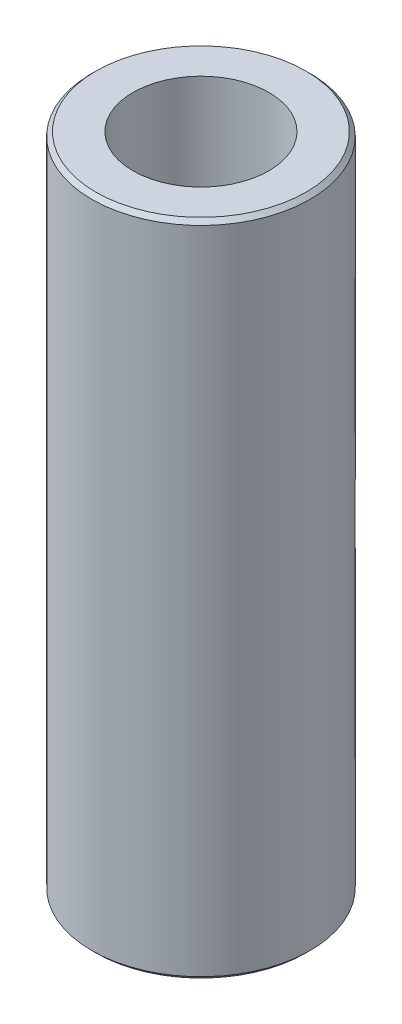
ISO-10303-21;
HEADER;
FILE_DESCRIPTION(('STEP AP214'),'2;1');
FILE_NAME('part.step','',(''),(''),'','','');
FILE_SCHEMA(('AUTOMOTIVE_DESIGN { 1 0 10303 214 1 1 1 1 }'));
ENDSEC;
DATA;
#1=APPLICATION_CONTEXT('core data for automotive mechanical design processes');
#2=APPLICATION_PROTOCOL_DEFINITION('international standard','automotive_design',2000,#1);
#3=PRODUCT_CONTEXT('',#1,'mechanical');
#4=PRODUCT('Part','Part','',(#3));
#5=PRODUCT_RELATED_PRODUCT_CATEGORY('part','',(#4));
#6=PRODUCT_DEFINITION_FORMATION('','',#4);
#7=PRODUCT_DEFINITION_CONTEXT('part definition',#1,'design');
#8=PRODUCT_DEFINITION('design','',#6,#7);
#9=PRODUCT_DEFINITION_SHAPE('','',#8);
#10=(LENGTH_UNIT() NAMED_UNIT(*) SI_UNIT(.MILLI.,.METRE.));
#11=(NAMED_UNIT(*) PLANE_ANGLE_UNIT() SI_UNIT($,.RADIAN.));
#12=(NAMED_UNIT(*) SI_UNIT($,.STERADIAN.) SOLID_ANGLE_UNIT());
#13=UNCERTAINTY_MEASURE_WITH_UNIT(LENGTH_MEASURE(1.E-05),#10,'distance_accuracy_value','');
#14=(GEOMETRIC_REPRESENTATION_CONTEXT(3) GLOBAL_UNCERTAINTY_ASSIGNED_CONTEXT((#13)) GLOBAL_UNIT_ASSIGNED_CONTEXT((#10,
#11,#12)) REPRESENTATION_CONTEXT('',''));
#15=CARTESIAN_POINT('',(0.,0.,0.));
#16=DIRECTION('',(0.,0.,1.));
#17=DIRECTION('',(1.,0.,0.));
#18=AXIS2_PLACEMENT_3D('',#15,#16,#17);
#19=CARTESIAN_POINT('',(0.,16.,0.));
#20=DIRECTION('',(0.,1.,0.));
#21=DIRECTION('',(0.,0.,1.));
#22=AXIS2_PLACEMENT_3D('',#19,#20,#21);
#23=PLANE('',#22);
#24=CARTESIAN_POINT('',(0.,16.,0.));
#25=DIRECTION('',(0.,1.,0.));
#26=DIRECTION('',(0.,0.,1.));
#27=AXIS2_PLACEMENT_3D('',#24,#25,#26);
#28=CIRCLE('',#27,2.55);
#29=CARTESIAN_POINT('',(0.,16.,2.55));
#30=VERTEX_POINT('',#29);
#31=EDGE_CURVE('E10',#30,#30,#28,.T.);
#32=ORIENTED_EDGE('',*,*,#31,.T.);
#33=EDGE_LOOP('',(#32));
#34=FACE_BOUND('',#33,.T.);
#35=CARTESIAN_POINT('',(0.,16.,0.));
#36=DIRECTION('',(0.,1.,0.));
#37=DIRECTION('',(0.,0.,1.));
#38=AXIS2_PLACEMENT_3D('',#35,#36,#37);
#39=CIRCLE('',#38,1.65);
#40=CARTESIAN_POINT('',(0.,16.,1.65));
#41=VERTEX_POINT('',#40);
#42=EDGE_CURVE('E75',#41,#41,#39,.T.);
#43=ORIENTED_EDGE('',*,*,#42,.F.);
#44=EDGE_LOOP('',(#43));
#45=FACE_BOUND('',#44,.T.);
#46=ADVANCED_FACE('F45',(#34,#45),#23,.T.);
#47=CARTESIAN_POINT('',(0.,0.,0.));
#48=DIRECTION('',(0.,1.,0.));
#49=DIRECTION('',(0.,0.,1.));
#50=AXIS2_PLACEMENT_3D('',#47,#48,#49);
#51=PLANE('',#50);
#52=CARTESIAN_POINT('',(0.,0.,0.));
#53=DIRECTION('',(0.,1.,0.));
#54=DIRECTION('',(0.,0.,1.));
#55=AXIS2_PLACEMENT_3D('',#52,#53,#54);
#56=CIRCLE('',#55,2.55);
#57=CARTESIAN_POINT('',(0.,0.,2.55));
#58=VERTEX_POINT('',#57);
#59=EDGE_CURVE('E60',#58,#58,#56,.F.);
#60=ORIENTED_EDGE('',*,*,#59,.T.);
#61=EDGE_LOOP('',(#60));
#62=FACE_BOUND('',#61,.T.);
#63=CARTESIAN_POINT('',(0.,0.,0.));
#64=DIRECTION('',(0.,1.,0.));
#65=DIRECTION('',(0.,0.,1.));
#66=AXIS2_PLACEMENT_3D('',#63,#64,#65);
#67=CIRCLE('',#66,1.65);
#68=CARTESIAN_POINT('',(0.,0.,1.65));
#69=VERTEX_POINT('',#68);
#70=EDGE_CURVE('E76',#69,#69,#67,.T.);
#71=ORIENTED_EDGE('',*,*,#70,.T.);
#72=EDGE_LOOP('',(#71));
#73=FACE_BOUND('',#72,.T.);
#74=ADVANCED_FACE('F88',(#62,#73),#51,.F.);
#75=CARTESIAN_POINT('',(0.,16.,0.));
#76=DIRECTION('',(0.,-1.,0.));
#77=DIRECTION('',(0.,0.,-1.));
#78=AXIS2_PLACEMENT_3D('',#75,#76,#77);
#79=CYLINDRICAL_SURFACE('',#78,2.65);
#80=CARTESIAN_POINT('',(0.,9.92093727122985,-2.65));
#81=CARTESIAN_POINT('',(-0.109299880358257,9.92093996636272,-2.6499948862549));
#82=CARTESIAN_POINT('',(-0.218735516084106,9.91533154839031,-2.64319472339226));
#83=CARTESIAN_POINT('',(-0.434911337620244,9.89247748867773,-2.6163438405316));
#84=CARTESIAN_POINT('',(-0.541645403418382,9.87520751834557,-2.59626542094695));
#85=CARTESIAN_POINT('',(-0.749444634932634,9.82785593080771,-2.54407371992826));
#86=CARTESIAN_POINT('',(-0.850499154428092,9.79775110564812,-2.51193865037942));
#87=CARTESIAN_POINT('',(-1.04340545777591,9.72332096294955,-2.43812451571945));
#88=CARTESIAN_POINT('',(-1.13526669877136,9.67901046029318,-2.39645540641701));
#89=CARTESIAN_POINT('',(-1.30368202598533,9.57700317526199,-2.3090244602587));
#90=CARTESIAN_POINT('',(-1.3806719886691,9.51985315088713,-2.26346714657872));
#91=CARTESIAN_POINT('',(-1.52121157776356,9.39144115928896,-2.17151557694385));
#92=CARTESIAN_POINT('',(-1.58476545859536,9.32018367295443,-2.12512159097926));
#93=CARTESIAN_POINT('',(-1.69348173797236,9.17050679416105,-2.0393852548776));
#94=CARTESIAN_POINT('',(-1.73962636611262,9.09294924171522,-1.99977627361691));
#95=CARTESIAN_POINT('',(-1.81965802951157,8.92889739783747,-1.92724481046527));
#96=CARTESIAN_POINT('',(-1.8535430035938,8.84240160678787,-1.89432345335086));
#97=CARTESIAN_POINT('',(-1.90991040098829,8.66238435506235,-1.83748825668406));
#98=CARTESIAN_POINT('',(-1.93232401900713,8.56882427550665,-1.81362898668467));
#99=CARTESIAN_POINT('',(-1.96626616702593,8.3776737334167,-1.77677413334917));
#100=CARTESIAN_POINT('',(-1.97779185439748,8.28008222529169,-1.76378138715402));
#101=CARTESIAN_POINT('',(-1.99078912817595,8.07868297984168,-1.74910429135332));
#102=CARTESIAN_POINT('',(-1.99175523655625,7.97480068677418,-1.74798854679981));
#103=CARTESIAN_POINT('',(-1.98237224519634,7.76819321961573,-1.75862103496549));
#104=CARTESIAN_POINT('',(-1.97202104403527,7.66546826400031,-1.77037165673815));
#105=CARTESIAN_POINT('',(-1.93918262550403,7.4623441738929,-1.80628683979361));
#106=CARTESIAN_POINT('',(-1.91649302075539,7.3620138056759,-1.83065809046578));
#107=CARTESIAN_POINT('',(-1.85788306257011,7.16866531711144,-1.89010596973172));
#108=CARTESIAN_POINT('',(-1.82196830212422,7.07564412582204,-1.92517807180354));
#109=CARTESIAN_POINT('',(-1.7374865152865,6.90285467456155,-2.00168919180041));
#110=CARTESIAN_POINT('',(-1.68938817364913,6.82274473308246,-2.04287293573195));
#111=CARTESIAN_POINT('',(-1.57989035450213,6.67435521285978,-2.12867568827054));
#112=CARTESIAN_POINT('',(-1.51849573287072,6.60607133151212,-2.17329343893393));
#113=CARTESIAN_POINT('',(-1.38606227403061,6.48507777884172,-2.25993950639344));
#114=CARTESIAN_POINT('',(-1.3155175774411,6.43184740246146,-2.30199930988023));
#115=CARTESIAN_POINT('',(-1.16463784764988,6.3374704166023,-2.38189106742887));
#116=CARTESIAN_POINT('',(-1.08430026438984,6.29632696409863,-2.41972191533724));
#117=CARTESIAN_POINT('',(-0.913610214612164,6.22448067436926,-2.4892861476947));
#118=CARTESIAN_POINT('',(-0.823040279445329,6.19410251537358,-2.52081908928487));
#119=CARTESIAN_POINT('',(-0.636236714367759,6.1443448294714,-2.57432670513686));
#120=CARTESIAN_POINT('',(-0.540000922761836,6.12496953089634,-2.5962977040463));
#121=CARTESIAN_POINT('',(-0.336297350772618,6.09510005462107,-2.63076312830331));
#122=CARTESIAN_POINT('',(-0.228550846088945,6.08545144023313,-2.64234680678111));
#123=CARTESIAN_POINT('',(-0.0120078626001847,6.07723013547213,-2.65219108788352));
#124=CARTESIAN_POINT('',(0.0967890346752566,6.07866205813101,-2.65044614155971));
#125=CARTESIAN_POINT('',(0.318166233823941,6.09307046908868,-2.63328751182415));
#126=CARTESIAN_POINT('',(0.430656674426821,6.10663174728199,-2.61718156740144));
#127=CARTESIAN_POINT('',(0.650374951440152,6.14710306876592,-2.57139922414339));
#128=CARTESIAN_POINT('',(0.757603494191999,6.17401131498317,-2.54172465226831));
#129=CARTESIAN_POINT('',(0.960968234121292,6.24196189970396,-2.47190850322656));
#130=CARTESIAN_POINT('',(1.05729898765296,6.28267439932679,-2.43201607172913));
#131=CARTESIAN_POINT('',(1.23817109954948,6.37964391234564,-2.3450978162835));
#132=CARTESIAN_POINT('',(1.32272277291879,6.43588719496971,-2.29807830987248));
#133=CARTESIAN_POINT('',(1.4711072272925,6.55899388516573,-2.20576037245185));
#134=CARTESIAN_POINT('',(1.53606177910542,6.62463285505502,-2.16062959541769));
#135=CARTESIAN_POINT('',(1.652599270101,6.76828149652157,-2.07286077420249));
#136=CARTESIAN_POINT('',(1.70418377814006,6.84628971494392,-2.03022243801069));
#137=CARTESIAN_POINT('',(1.79174339196401,7.00859854709301,-1.95330609713143));
#138=CARTESIAN_POINT('',(1.82834757715928,7.09241910115109,-1.918725564585));
#139=CARTESIAN_POINT('',(1.8899760362899,7.26709445231511,-1.85805474747734));
#140=CARTESIAN_POINT('',(1.91499771126375,7.35795082283135,-1.83196636883208));
#141=CARTESIAN_POINT('',(1.9548612150286,7.54714893725107,-1.78938602622824));
#142=CARTESIAN_POINT('',(1.96936011500942,7.6456359295011,-1.77321978412028));
#143=CARTESIAN_POINT('',(1.98754648694671,7.84482890351929,-1.75281058204535));
#144=CARTESIAN_POINT('',(1.99123093914461,7.94553549716752,-1.74857095240458));
#145=CARTESIAN_POINT('',(1.98790372825344,8.1508159126486,-1.75235574448801));
#146=CARTESIAN_POINT('',(1.98043374123042,8.2553734264186,-1.76090570242485));
#147=CARTESIAN_POINT('',(1.953538504682,8.46110209593366,-1.79069427062021));
#148=CARTESIAN_POINT('',(1.93411328649257,8.56227326055398,-1.81193284762048));
#149=CARTESIAN_POINT('',(1.88248234333485,8.75793819487395,-1.86551162448735));
#150=CARTESIAN_POINT('',(1.85031050132999,8.85244889113038,-1.89782236191781));
#151=CARTESIAN_POINT('',(1.77225076083763,9.03204361092245,-1.97090480896716));
#152=CARTESIAN_POINT('',(1.72637029761701,9.11713271033181,-2.01167192836729));
#153=CARTESIAN_POINT('',(1.62291380505914,9.27175030945498,-2.09591949761381));
#154=CARTESIAN_POINT('',(1.56596125272422,9.34180885452774,-2.13919357097303));
#155=CARTESIAN_POINT('',(1.43979763386694,9.46956946896724,-2.2260571116895));
#156=CARTESIAN_POINT('',(1.37058894319984,9.52727392839594,-2.26964651635175));
#157=CARTESIAN_POINT('',(1.22308035338382,9.62884972355572,-2.35235338637832));
#158=CARTESIAN_POINT('',(1.14500964271918,9.67299342790926,-2.391547221674));
#159=CARTESIAN_POINT('',(0.980594211255487,9.74966096210814,-2.4635334433979));
#160=CARTESIAN_POINT('',(0.894242819656945,9.78217532208685,-2.49632060300885));
#161=CARTESIAN_POINT('',(0.710489109449637,9.83803882714633,-2.55490345569599));
#162=CARTESIAN_POINT('',(0.6127375913227,9.86076147655736,-2.58019541054946));
#163=CARTESIAN_POINT('',(0.413275869217349,9.89533811475118,-2.61954462369192));
#164=CARTESIAN_POINT('',(0.311572165794522,9.90720922385962,-2.6336195743807));
#165=CARTESIAN_POINT('',(0.174425880299988,9.91633134141092,-2.64448445976145));
#166=CARTESIAN_POINT('',(0.139598401029225,9.91805985699657,-2.64655058879274));
#167=CARTESIAN_POINT('',(0.0698519028808608,9.92036238492652,-2.64930916862017));
#168=CARTESIAN_POINT('',(0.0349328850047668,9.92093640984953,-2.65000163438303));
#169=CARTESIAN_POINT('',(0.,9.92093727122985,-2.65));
#170=B_SPLINE_CURVE_WITH_KNOTS('',3,(#80,#81,#82,#83,#84,#85,#86,#87,#88,#89,#90,#91,#92,#93,
#94,#95,#96,#97,#98,#99,#100,#101,#102,#103,#104,#105,#106,#107,#108,#109,#110,#111,#112,#113,
#114,#115,#116,#117,#118,#119,#120,#121,#122,#123,#124,#125,#126,#127,#128,#129,#130,#131,#132,
#133,#134,#135,#136,#137,#138,#139,#140,#141,#142,#143,#144,#145,#146,#147,#148,#149,#150,#151,
#152,#153,#154,#155,#156,#157,#158,#159,#160,#161,#162,#163,#164,#165,#166,#167,#168,#169),
.UNSPECIFIED.,.T.,.F.,(4,2,2,2,2,2,2,2,2,2,2,2,2,2,2,2,2,2,2,2,2,2,2,2,2,2,2,2,2,2,2,2,2,2,2,2,
2,2,2,2,2,2,2,2,4),(0.,0.327777575252413,0.656241088809568,0.985301065236504,1.31401898034577,
1.6307559769276,1.94739253072004,2.24165549395586,2.53596790771866,2.83202550946527,
3.12816038478865,3.43841221482865,3.74872166283978,4.06428179400444,4.37970862603982,
4.68447386995655,4.98912799897434,5.28138433900324,5.57371694553315,5.87423680405182,
6.17487207248285,6.49983556383998,6.8249343507679,7.16660580249297,7.50823126309364,
7.84221024357345,8.17589489327533,8.48263239480398,8.78933388708736,9.08135170694174,
9.37343501999251,9.67465522264977,9.97595952814893,10.2899894537446,10.6040185562373,
10.9172184503088,11.2302487787803,11.5291083714939,11.8279100934972,12.1202446332184,
12.4128166841727,12.722029856276,13.0307543407813,13.1355151242645,13.2402747663236),.UNSPECIFIED.);
#171=CARTESIAN_POINT('',(0.,9.92093727122985,-2.65));
#172=VERTEX_POINT('',#171);
#173=EDGE_CURVE('E50',#172,#172,#170,.T.);
#174=ORIENTED_EDGE('',*,*,#173,.T.);
#175=EDGE_LOOP('',(#174));
#176=FACE_BOUND('',#175,.T.);
#177=CARTESIAN_POINT('',(0.,0.0999999999999994,0.));
#178=DIRECTION('',(0.,1.,0.));
#179=DIRECTION('',(0.,0.,1.));
#180=AXIS2_PLACEMENT_3D('',#177,#178,#179);
#181=CIRCLE('',#180,2.65);
#182=CARTESIAN_POINT('',(0.,0.0999999999999994,2.65));
#183=VERTEX_POINT('',#182);
#184=EDGE_CURVE('E65',#183,#183,#181,.T.);
#185=ORIENTED_EDGE('',*,*,#184,.T.);
#186=EDGE_LOOP('',(#185));
#187=FACE_BOUND('',#186,.T.);
#188=CARTESIAN_POINT('',(0.,15.9,0.));
#189=DIRECTION('',(0.,1.,0.));
#190=DIRECTION('',(0.,0.,1.));
#191=AXIS2_PLACEMENT_3D('',#188,#189,#190);
#192=CIRCLE('',#191,2.65);
#193=CARTESIAN_POINT('',(0.,15.9,2.65));
#194=VERTEX_POINT('',#193);
#195=EDGE_CURVE('E71',#194,#194,#192,.F.);
#196=ORIENTED_EDGE('',*,*,#195,.T.);
#197=EDGE_LOOP('',(#196));
#198=FACE_BOUND('',#197,.T.);
#199=ADVANCED_FACE('F93',(#176,#187,#198),#79,.T.);
#200=CARTESIAN_POINT('',(0.,16.,0.));
#201=DIRECTION('',(0.,-1.,0.));
#202=DIRECTION('',(0.,0.,-1.));
#203=AXIS2_PLACEMENT_3D('',#200,#201,#202);
#204=CYLINDRICAL_SURFACE('',#203,1.65);
#205=ORIENTED_EDGE('',*,*,#42,.T.);
#206=EDGE_LOOP('',(#205));
#207=FACE_BOUND('',#206,.T.);
#208=ORIENTED_EDGE('',*,*,#70,.F.);
#209=EDGE_LOOP('',(#208));
#210=FACE_BOUND('',#209,.T.);
#211=ADVANCED_FACE('F84',(#207,#210),#204,.F.);
#212=CARTESIAN_POINT('',(0.,0.0999999999999994,0.));
#213=DIRECTION('',(0.,1.,0.));
#214=DIRECTION('',(0.,0.,1.));
#215=AXIS2_PLACEMENT_3D('',#212,#213,#214);
#216=CONICAL_SURFACE('',#215,2.65,0.78539816339745);
#217=ORIENTED_EDGE('',*,*,#59,.F.);
#218=EDGE_LOOP('',(#217));
#219=FACE_BOUND('',#218,.T.);
#220=ORIENTED_EDGE('',*,*,#184,.F.);
#221=EDGE_LOOP('',(#220));
#222=FACE_BOUND('',#221,.T.);
#223=ADVANCED_FACE('F101',(#219,#222),#216,.T.);
#224=CARTESIAN_POINT('',(0.,16.,0.));
#225=DIRECTION('',(0.,-1.,0.));
#226=DIRECTION('',(0.,0.,-1.));
#227=AXIS2_PLACEMENT_3D('',#224,#225,#226);
#228=CONICAL_SURFACE('',#227,2.55,0.78539816339745);
#229=ORIENTED_EDGE('',*,*,#195,.F.);
#230=EDGE_LOOP('',(#229));
#231=FACE_BOUND('',#230,.T.);
#232=ORIENTED_EDGE('',*,*,#31,.F.);
#233=EDGE_LOOP('',(#232));
#234=FACE_BOUND('',#233,.T.);
#235=ADVANCED_FACE('F48',(#231,#234),#228,.T.);
#236=CARTESIAN_POINT('',(-8.8,8.,-4.25));
#237=DIRECTION('',(1.,0.,0.));
#238=DIRECTION('',(0.,0.,-1.));
#239=AXIS2_PLACEMENT_3D('',#236,#237,#238);
#240=CYLINDRICAL_SURFACE('',#239,2.5);
#241=ORIENTED_EDGE('',*,*,#173,.F.);
#242=EDGE_LOOP('',(#241));
#243=FACE_BOUND('',#242,.T.);
#244=ADVANCED_FACE('F110',(#243),#240,.F.);
#245=CLOSED_SHELL('',(#46,#74,#199,#211,#223,#235,#244));
#246=MANIFOLD_SOLID_BREP('B2',#245);
#247=ADVANCED_BREP_SHAPE_REPRESENTATION('',(#18,#246),#14);
#248=SHAPE_DEFINITION_REPRESENTATION(#9,#247);
ENDSEC;
END-ISO-10303-21;
